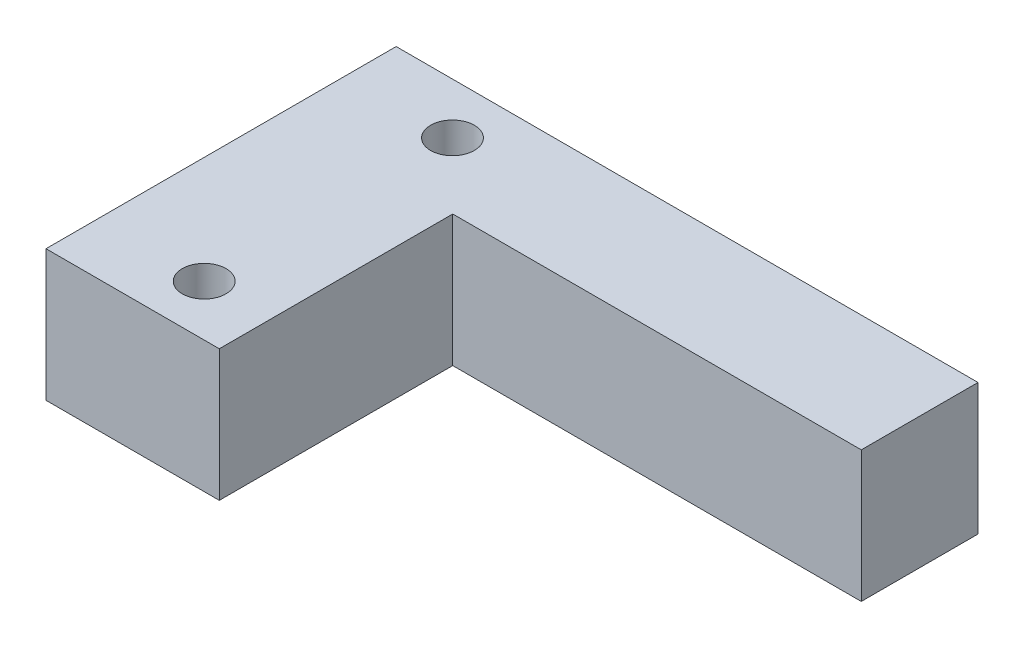
ISO-10303-21;
HEADER;
FILE_DESCRIPTION(('STEP AP214'),'2;1');
FILE_NAME('part.step','',(''),(''),'','','');
FILE_SCHEMA(('AUTOMOTIVE_DESIGN { 1 0 10303 214 1 1 1 1 }'));
ENDSEC;
DATA;
#1=APPLICATION_CONTEXT('core data for automotive mechanical design processes');
#2=APPLICATION_PROTOCOL_DEFINITION('international standard','automotive_design',2000,#1);
#3=PRODUCT_CONTEXT('',#1,'mechanical');
#4=PRODUCT('Part','Part','',(#3));
#5=PRODUCT_RELATED_PRODUCT_CATEGORY('part','',(#4));
#6=PRODUCT_DEFINITION_FORMATION('','',#4);
#7=PRODUCT_DEFINITION_CONTEXT('part definition',#1,'design');
#8=PRODUCT_DEFINITION('design','',#6,#7);
#9=PRODUCT_DEFINITION_SHAPE('','',#8);
#10=(LENGTH_UNIT() NAMED_UNIT(*) SI_UNIT(.MILLI.,.METRE.));
#11=(NAMED_UNIT(*) PLANE_ANGLE_UNIT() SI_UNIT($,.RADIAN.));
#12=(NAMED_UNIT(*) SI_UNIT($,.STERADIAN.) SOLID_ANGLE_UNIT());
#13=UNCERTAINTY_MEASURE_WITH_UNIT(LENGTH_MEASURE(1.E-05),#10,'distance_accuracy_value','');
#14=(GEOMETRIC_REPRESENTATION_CONTEXT(3) GLOBAL_UNCERTAINTY_ASSIGNED_CONTEXT((#13)) GLOBAL_UNIT_ASSIGNED_CONTEXT((#10,
#11,#12)) REPRESENTATION_CONTEXT('',''));
#15=CARTESIAN_POINT('',(0.,0.,0.));
#16=DIRECTION('',(0.,0.,1.));
#17=DIRECTION('',(1.,0.,0.));
#18=AXIS2_PLACEMENT_3D('',#15,#16,#17);
#19=CARTESIAN_POINT('',(-19.939,9.,12.));
#20=DIRECTION('',(-1.,0.,0.));
#21=DIRECTION('',(0.,0.,1.));
#22=AXIS2_PLACEMENT_3D('',#19,#20,#21);
#23=PLANE('',#22);
#24=DIRECTION('',(0.,0.,-1.));
#25=VECTOR('',#24,1.);
#26=CARTESIAN_POINT('',(-19.939,0.,12.));
#27=LINE('',#26,#25);
#28=CARTESIAN_POINT('',(-19.939,0.,12.));
#29=VERTEX_POINT('',#28);
#30=CARTESIAN_POINT('',(-19.939,0.,-12.));
#31=VERTEX_POINT('',#30);
#32=EDGE_CURVE('E127',#29,#31,#27,.T.);
#33=ORIENTED_EDGE('',*,*,#32,.F.);
#34=DIRECTION('',(0.,-1.,0.));
#35=VECTOR('',#34,1.);
#36=CARTESIAN_POINT('',(-19.939,9.,12.));
#37=LINE('',#36,#35);
#38=CARTESIAN_POINT('',(-19.939,9.,12.));
#39=VERTEX_POINT('',#38);
#40=EDGE_CURVE('E11',#39,#29,#37,.T.);
#41=ORIENTED_EDGE('',*,*,#40,.F.);
#42=DIRECTION('',(0.,0.,-1.));
#43=VECTOR('',#42,1.);
#44=CARTESIAN_POINT('',(-19.939,9.,12.));
#45=LINE('',#44,#43);
#46=CARTESIAN_POINT('',(-19.939,9.,-12.));
#47=VERTEX_POINT('',#46);
#48=EDGE_CURVE('E108',#39,#47,#45,.T.);
#49=ORIENTED_EDGE('',*,*,#48,.T.);
#50=DIRECTION('',(0.,-1.,0.));
#51=VECTOR('',#50,1.);
#52=CARTESIAN_POINT('',(-19.939,9.,-12.));
#53=LINE('',#52,#51);
#54=EDGE_CURVE('E36',#47,#31,#53,.T.);
#55=ORIENTED_EDGE('',*,*,#54,.T.);
#56=EDGE_LOOP('',(#33,#41,#49,#55));
#57=FACE_BOUND('',#56,.T.);
#58=ADVANCED_FACE('F33',(#57),#23,.T.);
#59=CARTESIAN_POINT('',(-19.939,9.,12.));
#60=DIRECTION('',(0.,0.,-1.));
#61=DIRECTION('',(-1.,0.,0.));
#62=AXIS2_PLACEMENT_3D('',#59,#60,#61);
#63=PLANE('',#62);
#64=DIRECTION('',(1.,0.,0.));
#65=VECTOR('',#64,1.);
#66=CARTESIAN_POINT('',(-19.939,0.,12.));
#67=LINE('',#66,#65);
#68=CARTESIAN_POINT('',(-8.061,0.,12.));
#69=VERTEX_POINT('',#68);
#70=EDGE_CURVE('E103',#29,#69,#67,.T.);
#71=ORIENTED_EDGE('',*,*,#70,.T.);
#72=DIRECTION('',(0.,1.,0.));
#73=VECTOR('',#72,1.);
#74=CARTESIAN_POINT('',(-8.061,0.,12.));
#75=LINE('',#74,#73);
#76=CARTESIAN_POINT('',(-8.061,9.,12.));
#77=VERTEX_POINT('',#76);
#78=EDGE_CURVE('E91',#69,#77,#75,.T.);
#79=ORIENTED_EDGE('',*,*,#78,.T.);
#80=DIRECTION('',(1.,0.,0.));
#81=VECTOR('',#80,1.);
#82=CARTESIAN_POINT('',(-19.939,9.,12.));
#83=LINE('',#82,#81);
#84=EDGE_CURVE('E119',#39,#77,#83,.T.);
#85=ORIENTED_EDGE('',*,*,#84,.F.);
#86=ORIENTED_EDGE('',*,*,#40,.T.);
#87=EDGE_LOOP('',(#71,#79,#85,#86));
#88=FACE_BOUND('',#87,.T.);
#89=ADVANCED_FACE('F107',(#88),#63,.F.);
#90=CARTESIAN_POINT('',(19.939,9.,12.));
#91=DIRECTION('',(-1.,0.,0.));
#92=DIRECTION('',(0.,0.,1.));
#93=AXIS2_PLACEMENT_3D('',#90,#91,#92);
#94=PLANE('',#93);
#95=DIRECTION('',(0.,0.,-1.));
#96=VECTOR('',#95,1.);
#97=CARTESIAN_POINT('',(19.939,9.,12.));
#98=LINE('',#97,#96);
#99=CARTESIAN_POINT('',(19.939,9.,-4.));
#100=VERTEX_POINT('',#99);
#101=CARTESIAN_POINT('',(19.939,9.,-12.));
#102=VERTEX_POINT('',#101);
#103=EDGE_CURVE('E120',#100,#102,#98,.T.);
#104=ORIENTED_EDGE('',*,*,#103,.F.);
#105=DIRECTION('',(0.,1.,0.));
#106=VECTOR('',#105,1.);
#107=CARTESIAN_POINT('',(19.939,0.,-4.));
#108=LINE('',#107,#106);
#109=CARTESIAN_POINT('',(19.939,0.,-4.));
#110=VERTEX_POINT('',#109);
#111=EDGE_CURVE('E96',#110,#100,#108,.T.);
#112=ORIENTED_EDGE('',*,*,#111,.F.);
#113=DIRECTION('',(0.,0.,-1.));
#114=VECTOR('',#113,1.);
#115=CARTESIAN_POINT('',(19.939,0.,12.));
#116=LINE('',#115,#114);
#117=CARTESIAN_POINT('',(19.939,0.,-12.));
#118=VERTEX_POINT('',#117);
#119=EDGE_CURVE('E109',#110,#118,#116,.T.);
#120=ORIENTED_EDGE('',*,*,#119,.T.);
#121=DIRECTION('',(0.,-1.,0.));
#122=VECTOR('',#121,1.);
#123=CARTESIAN_POINT('',(19.939,9.,-12.));
#124=LINE('',#123,#122);
#125=EDGE_CURVE('E41',#102,#118,#124,.T.);
#126=ORIENTED_EDGE('',*,*,#125,.F.);
#127=EDGE_LOOP('',(#104,#112,#120,#126));
#128=FACE_BOUND('',#127,.T.);
#129=ADVANCED_FACE('F132',(#128),#94,.F.);
#130=CARTESIAN_POINT('',(-19.939,9.,-12.));
#131=DIRECTION('',(0.,0.,-1.));
#132=DIRECTION('',(-1.,0.,0.));
#133=AXIS2_PLACEMENT_3D('',#130,#131,#132);
#134=PLANE('',#133);
#135=DIRECTION('',(1.,0.,0.));
#136=VECTOR('',#135,1.);
#137=CARTESIAN_POINT('',(-19.939,0.,-12.));
#138=LINE('',#137,#136);
#139=EDGE_CURVE('E113',#31,#118,#138,.T.);
#140=ORIENTED_EDGE('',*,*,#139,.F.);
#141=ORIENTED_EDGE('',*,*,#54,.F.);
#142=DIRECTION('',(1.,0.,0.));
#143=VECTOR('',#142,1.);
#144=CARTESIAN_POINT('',(-19.939,9.,-12.));
#145=LINE('',#144,#143);
#146=EDGE_CURVE('E111',#47,#102,#145,.T.);
#147=ORIENTED_EDGE('',*,*,#146,.T.);
#148=ORIENTED_EDGE('',*,*,#125,.T.);
#149=EDGE_LOOP('',(#140,#141,#147,#148));
#150=FACE_BOUND('',#149,.T.);
#151=ADVANCED_FACE('F129',(#150),#134,.T.);
#152=CARTESIAN_POINT('',(0.,9.,0.));
#153=DIRECTION('',(0.,-1.,0.));
#154=DIRECTION('',(0.,0.,-1.));
#155=AXIS2_PLACEMENT_3D('',#152,#153,#154);
#156=PLANE('',#155);
#157=CARTESIAN_POINT('',(-12.589,9.,8.509));
#158=DIRECTION('',(0.,1.,0.));
#159=DIRECTION('',(0.,0.,1.));
#160=AXIS2_PLACEMENT_3D('',#157,#158,#159);
#161=CIRCLE('',#160,1.5);
#162=CARTESIAN_POINT('',(-12.589,9.,10.009));
#163=VERTEX_POINT('',#162);
#164=EDGE_CURVE('E173',#163,#163,#161,.T.);
#165=ORIENTED_EDGE('',*,*,#164,.F.);
#166=EDGE_LOOP('',(#165));
#167=FACE_BOUND('',#166,.T.);
#168=CARTESIAN_POINT('',(-12.589,9.,-8.509));
#169=DIRECTION('',(0.,1.,0.));
#170=DIRECTION('',(0.,0.,1.));
#171=AXIS2_PLACEMENT_3D('',#168,#169,#170);
#172=CIRCLE('',#171,1.5);
#173=CARTESIAN_POINT('',(-12.589,9.,-7.009));
#174=VERTEX_POINT('',#173);
#175=EDGE_CURVE('E178',#174,#174,#172,.T.);
#176=ORIENTED_EDGE('',*,*,#175,.F.);
#177=EDGE_LOOP('',(#176));
#178=FACE_BOUND('',#177,.T.);
#179=ORIENTED_EDGE('',*,*,#84,.T.);
#180=DIRECTION('',(0.,0.,1.));
#181=VECTOR('',#180,1.);
#182=CARTESIAN_POINT('',(-8.061,9.,12.));
#183=LINE('',#182,#181);
#184=CARTESIAN_POINT('',(-8.061,9.,-4.));
#185=VERTEX_POINT('',#184);
#186=EDGE_CURVE('E94',#185,#77,#183,.T.);
#187=ORIENTED_EDGE('',*,*,#186,.F.);
#188=DIRECTION('',(-1.,0.,0.));
#189=VECTOR('',#188,1.);
#190=CARTESIAN_POINT('',(-8.061,9.,-4.));
#191=LINE('',#190,#189);
#192=EDGE_CURVE('E105',#100,#185,#191,.T.);
#193=ORIENTED_EDGE('',*,*,#192,.F.);
#194=ORIENTED_EDGE('',*,*,#103,.T.);
#195=ORIENTED_EDGE('',*,*,#146,.F.);
#196=ORIENTED_EDGE('',*,*,#48,.F.);
#197=EDGE_LOOP('',(#179,#187,#193,#194,#195,#196));
#198=FACE_BOUND('',#197,.T.);
#199=ADVANCED_FACE('F131',(#167,#178,#198),#156,.F.);
#200=CARTESIAN_POINT('',(0.,0.,0.));
#201=DIRECTION('',(0.,-1.,0.));
#202=DIRECTION('',(0.,0.,-1.));
#203=AXIS2_PLACEMENT_3D('',#200,#201,#202);
#204=PLANE('',#203);
#205=CARTESIAN_POINT('',(-12.589,0.,8.509));
#206=DIRECTION('',(0.,1.,0.));
#207=DIRECTION('',(0.,0.,1.));
#208=AXIS2_PLACEMENT_3D('',#205,#206,#207);
#209=CIRCLE('',#208,1.5);
#210=CARTESIAN_POINT('',(-12.589,0.,10.009));
#211=VERTEX_POINT('',#210);
#212=EDGE_CURVE('E170',#211,#211,#209,.T.);
#213=ORIENTED_EDGE('',*,*,#212,.T.);
#214=EDGE_LOOP('',(#213));
#215=FACE_BOUND('',#214,.T.);
#216=CARTESIAN_POINT('',(-12.589,0.,-8.509));
#217=DIRECTION('',(0.,1.,0.));
#218=DIRECTION('',(0.,0.,1.));
#219=AXIS2_PLACEMENT_3D('',#216,#217,#218);
#220=CIRCLE('',#219,1.5);
#221=CARTESIAN_POINT('',(-12.589,0.,-7.009));
#222=VERTEX_POINT('',#221);
#223=EDGE_CURVE('E174',#222,#222,#220,.T.);
#224=ORIENTED_EDGE('',*,*,#223,.T.);
#225=EDGE_LOOP('',(#224));
#226=FACE_BOUND('',#225,.T.);
#227=DIRECTION('',(0.,0.,1.));
#228=VECTOR('',#227,1.);
#229=CARTESIAN_POINT('',(-8.061,0.,12.));
#230=LINE('',#229,#228);
#231=CARTESIAN_POINT('',(-8.061,0.,-4.));
#232=VERTEX_POINT('',#231);
#233=EDGE_CURVE('E49',#232,#69,#230,.T.);
#234=ORIENTED_EDGE('',*,*,#233,.T.);
#235=ORIENTED_EDGE('',*,*,#70,.F.);
#236=ORIENTED_EDGE('',*,*,#32,.T.);
#237=ORIENTED_EDGE('',*,*,#139,.T.);
#238=ORIENTED_EDGE('',*,*,#119,.F.);
#239=DIRECTION('',(-1.,0.,0.));
#240=VECTOR('',#239,1.);
#241=CARTESIAN_POINT('',(-8.061,0.,-4.));
#242=LINE('',#241,#240);
#243=EDGE_CURVE('E97',#110,#232,#242,.T.);
#244=ORIENTED_EDGE('',*,*,#243,.T.);
#245=EDGE_LOOP('',(#234,#235,#236,#237,#238,#244));
#246=FACE_BOUND('',#245,.T.);
#247=ADVANCED_FACE('F101',(#215,#226,#246),#204,.T.);
#248=CARTESIAN_POINT('',(-8.061,0.,12.));
#249=DIRECTION('',(-1.,0.,0.));
#250=DIRECTION('',(0.,0.,1.));
#251=AXIS2_PLACEMENT_3D('',#248,#249,#250);
#252=PLANE('',#251);
#253=ORIENTED_EDGE('',*,*,#186,.T.);
#254=ORIENTED_EDGE('',*,*,#78,.F.);
#255=ORIENTED_EDGE('',*,*,#233,.F.);
#256=DIRECTION('',(0.,1.,0.));
#257=VECTOR('',#256,1.);
#258=CARTESIAN_POINT('',(-8.061,0.,-4.));
#259=LINE('',#258,#257);
#260=EDGE_CURVE('E128',#232,#185,#259,.T.);
#261=ORIENTED_EDGE('',*,*,#260,.T.);
#262=EDGE_LOOP('',(#253,#254,#255,#261));
#263=FACE_BOUND('',#262,.T.);
#264=ADVANCED_FACE('F92',(#263),#252,.F.);
#265=CARTESIAN_POINT('',(-8.061,0.,-4.));
#266=DIRECTION('',(0.,0.,-1.));
#267=DIRECTION('',(-1.,0.,0.));
#268=AXIS2_PLACEMENT_3D('',#265,#266,#267);
#269=PLANE('',#268);
#270=ORIENTED_EDGE('',*,*,#192,.T.);
#271=ORIENTED_EDGE('',*,*,#260,.F.);
#272=ORIENTED_EDGE('',*,*,#243,.F.);
#273=ORIENTED_EDGE('',*,*,#111,.T.);
#274=EDGE_LOOP('',(#270,#271,#272,#273));
#275=FACE_BOUND('',#274,.T.);
#276=ADVANCED_FACE('F154',(#275),#269,.F.);
#277=CARTESIAN_POINT('',(-12.589,0.,-8.509));
#278=DIRECTION('',(0.,1.,0.));
#279=DIRECTION('',(0.,0.,1.));
#280=AXIS2_PLACEMENT_3D('',#277,#278,#279);
#281=CYLINDRICAL_SURFACE('',#280,1.5);
#282=ORIENTED_EDGE('',*,*,#223,.F.);
#283=EDGE_LOOP('',(#282));
#284=FACE_BOUND('',#283,.T.);
#285=ORIENTED_EDGE('',*,*,#175,.T.);
#286=EDGE_LOOP('',(#285));
#287=FACE_BOUND('',#286,.T.);
#288=ADVANCED_FACE('F157',(#284,#287),#281,.F.);
#289=CARTESIAN_POINT('',(-12.589,0.,8.509));
#290=DIRECTION('',(0.,1.,0.));
#291=DIRECTION('',(0.,0.,1.));
#292=AXIS2_PLACEMENT_3D('',#289,#290,#291);
#293=CYLINDRICAL_SURFACE('',#292,1.5);
#294=ORIENTED_EDGE('',*,*,#212,.F.);
#295=EDGE_LOOP('',(#294));
#296=FACE_BOUND('',#295,.T.);
#297=ORIENTED_EDGE('',*,*,#164,.T.);
#298=EDGE_LOOP('',(#297));
#299=FACE_BOUND('',#298,.T.);
#300=ADVANCED_FACE('F161',(#296,#299),#293,.F.);
#301=CLOSED_SHELL('',(#58,#89,#129,#151,#199,#247,#264,#276,#288,#300));
#302=MANIFOLD_SOLID_BREP('B2',#301);
#303=ADVANCED_BREP_SHAPE_REPRESENTATION('',(#18,#302),#14);
#304=SHAPE_DEFINITION_REPRESENTATION(#9,#303);
ENDSEC;
END-ISO-10303-21;
